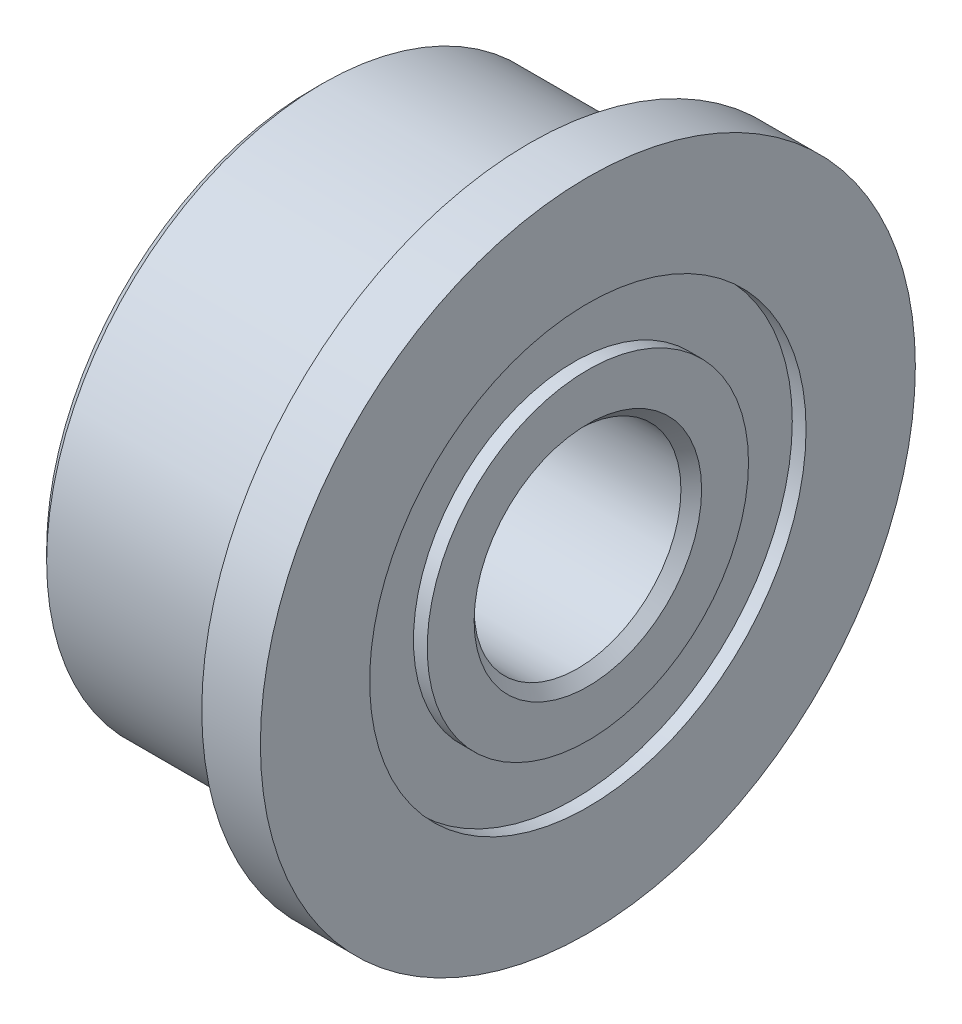
ISO-10303-21;
HEADER;
FILE_DESCRIPTION(('STEP AP214'),'2;1');
FILE_NAME('part.step','',(''),(''),'','','');
FILE_SCHEMA(('AUTOMOTIVE_DESIGN { 1 0 10303 214 1 1 1 1 }'));
ENDSEC;
DATA;
#1=APPLICATION_CONTEXT('core data for automotive mechanical design processes');
#2=APPLICATION_PROTOCOL_DEFINITION('international standard','automotive_design',2000,#1);
#3=PRODUCT_CONTEXT('',#1,'mechanical');
#4=PRODUCT('Part','Part','',(#3));
#5=PRODUCT_RELATED_PRODUCT_CATEGORY('part','',(#4));
#6=PRODUCT_DEFINITION_FORMATION('','',#4);
#7=PRODUCT_DEFINITION_CONTEXT('part definition',#1,'design');
#8=PRODUCT_DEFINITION('design','',#6,#7);
#9=PRODUCT_DEFINITION_SHAPE('','',#8);
#10=(LENGTH_UNIT() NAMED_UNIT(*) SI_UNIT(.MILLI.,.METRE.));
#11=(NAMED_UNIT(*) PLANE_ANGLE_UNIT() SI_UNIT($,.RADIAN.));
#12=(NAMED_UNIT(*) SI_UNIT($,.STERADIAN.) SOLID_ANGLE_UNIT());
#13=UNCERTAINTY_MEASURE_WITH_UNIT(LENGTH_MEASURE(1.E-05),#10,'distance_accuracy_value','');
#14=(GEOMETRIC_REPRESENTATION_CONTEXT(3) GLOBAL_UNCERTAINTY_ASSIGNED_CONTEXT((#13)) GLOBAL_UNIT_ASSIGNED_CONTEXT((#10,
#11,#12)) REPRESENTATION_CONTEXT('',''));
#15=CARTESIAN_POINT('',(0.,0.,0.));
#16=DIRECTION('',(0.,0.,1.));
#17=DIRECTION('',(1.,0.,0.));
#18=AXIS2_PLACEMENT_3D('',#15,#16,#17);
#19=CARTESIAN_POINT('',(-4.,2.33,0.));
#20=DIRECTION('',(-1.,0.,0.));
#21=DIRECTION('',(0.,0.,1.));
#22=AXIS2_PLACEMENT_3D('',#19,#20,#21);
#23=PLANE('',#22);
#24=CARTESIAN_POINT('',(-4.,0.,0.));
#25=DIRECTION('',(-1.,0.,0.));
#26=DIRECTION('',(0.,0.,1.));
#27=AXIS2_PLACEMENT_3D('',#24,#25,#26);
#28=CIRCLE('',#27,1.65);
#29=CARTESIAN_POINT('',(-4.,0.,1.65));
#30=VERTEX_POINT('',#29);
#31=EDGE_CURVE('E42',#30,#30,#28,.F.);
#32=ORIENTED_EDGE('',*,*,#31,.T.);
#33=EDGE_LOOP('',(#32));
#34=FACE_BOUND('',#33,.T.);
#35=CARTESIAN_POINT('',(-4.,0.,0.));
#36=DIRECTION('',(1.,0.,0.));
#37=DIRECTION('',(0.,0.,-1.));
#38=AXIS2_PLACEMENT_3D('',#35,#36,#37);
#39=CIRCLE('',#38,2.33);
#40=CARTESIAN_POINT('',(-4.,0.,-2.33));
#41=VERTEX_POINT('',#40);
#42=EDGE_CURVE('E90',#41,#41,#39,.T.);
#43=ORIENTED_EDGE('',*,*,#42,.F.);
#44=EDGE_LOOP('',(#43));
#45=FACE_BOUND('',#44,.T.);
#46=ADVANCED_FACE('F31',(#34,#45),#23,.T.);
#47=CARTESIAN_POINT('',(0.,0.,0.));
#48=DIRECTION('',(1.,0.,0.));
#49=DIRECTION('',(0.,0.,-1.));
#50=AXIS2_PLACEMENT_3D('',#47,#48,#49);
#51=CYLINDRICAL_SURFACE('',#50,1.5);
#52=CARTESIAN_POINT('',(-0.149999999999999,0.,0.));
#53=DIRECTION('',(1.,0.,0.));
#54=DIRECTION('',(0.,0.,-1.));
#55=AXIS2_PLACEMENT_3D('',#52,#53,#54);
#56=CIRCLE('',#55,1.5);
#57=CARTESIAN_POINT('',(-0.149999999999999,0.,-1.5));
#58=VERTEX_POINT('',#57);
#59=EDGE_CURVE('E51',#58,#58,#56,.T.);
#60=ORIENTED_EDGE('',*,*,#59,.T.);
#61=EDGE_LOOP('',(#60));
#62=FACE_BOUND('',#61,.T.);
#63=CARTESIAN_POINT('',(-3.85,0.,0.));
#64=DIRECTION('',(-1.,0.,0.));
#65=DIRECTION('',(0.,0.,1.));
#66=AXIS2_PLACEMENT_3D('',#63,#64,#65);
#67=CIRCLE('',#66,1.5);
#68=CARTESIAN_POINT('',(-3.85,0.,1.5));
#69=VERTEX_POINT('',#68);
#70=EDGE_CURVE('E54',#69,#69,#67,.T.);
#71=ORIENTED_EDGE('',*,*,#70,.T.);
#72=EDGE_LOOP('',(#71));
#73=FACE_BOUND('',#72,.T.);
#74=ADVANCED_FACE('F98',(#62,#73),#51,.F.);
#75=CARTESIAN_POINT('',(0.,1.5,0.));
#76=DIRECTION('',(1.,0.,0.));
#77=DIRECTION('',(0.,0.,-1.));
#78=AXIS2_PLACEMENT_3D('',#75,#76,#77);
#79=PLANE('',#78);
#80=CARTESIAN_POINT('',(0.,0.,0.));
#81=DIRECTION('',(1.,0.,0.));
#82=DIRECTION('',(0.,0.,-1.));
#83=AXIS2_PLACEMENT_3D('',#80,#81,#82);
#84=CIRCLE('',#83,1.65);
#85=CARTESIAN_POINT('',(0.,0.,-1.65));
#86=VERTEX_POINT('',#85);
#87=EDGE_CURVE('E46',#86,#86,#84,.F.);
#88=ORIENTED_EDGE('',*,*,#87,.T.);
#89=EDGE_LOOP('',(#88));
#90=FACE_BOUND('',#89,.T.);
#91=CARTESIAN_POINT('',(0.,0.,0.));
#92=DIRECTION('',(1.,0.,0.));
#93=DIRECTION('',(0.,0.,-1.));
#94=AXIS2_PLACEMENT_3D('',#91,#92,#93);
#95=CIRCLE('',#94,2.33);
#96=CARTESIAN_POINT('',(0.,0.,-2.33));
#97=VERTEX_POINT('',#96);
#98=EDGE_CURVE('E57',#97,#97,#95,.T.);
#99=ORIENTED_EDGE('',*,*,#98,.T.);
#100=EDGE_LOOP('',(#99));
#101=FACE_BOUND('',#100,.T.);
#102=ADVANCED_FACE('F104',(#90,#101),#79,.T.);
#103=CARTESIAN_POINT('',(0.,0.,0.));
#104=DIRECTION('',(1.,0.,0.));
#105=DIRECTION('',(0.,0.,-1.));
#106=AXIS2_PLACEMENT_3D('',#103,#104,#105);
#107=CYLINDRICAL_SURFACE('',#106,2.33);
#108=CARTESIAN_POINT('',(-0.2,0.,0.));
#109=DIRECTION('',(1.,0.,0.));
#110=DIRECTION('',(0.,0.,-1.));
#111=AXIS2_PLACEMENT_3D('',#108,#109,#110);
#112=CIRCLE('',#111,2.33);
#113=CARTESIAN_POINT('',(-0.2,0.,-2.33));
#114=VERTEX_POINT('',#113);
#115=EDGE_CURVE('E60',#114,#114,#112,.T.);
#116=ORIENTED_EDGE('',*,*,#115,.T.);
#117=EDGE_LOOP('',(#116));
#118=FACE_BOUND('',#117,.T.);
#119=ORIENTED_EDGE('',*,*,#98,.F.);
#120=EDGE_LOOP('',(#119));
#121=FACE_BOUND('',#120,.T.);
#122=ADVANCED_FACE('F171',(#118,#121),#107,.T.);
#123=CARTESIAN_POINT('',(-0.2,3.165,0.));
#124=DIRECTION('',(1.,0.,0.));
#125=DIRECTION('',(0.,0.,-1.));
#126=AXIS2_PLACEMENT_3D('',#123,#124,#125);
#127=PLANE('',#126);
#128=CARTESIAN_POINT('',(-0.2,0.,0.));
#129=DIRECTION('',(1.,0.,0.));
#130=DIRECTION('',(0.,0.,-1.));
#131=AXIS2_PLACEMENT_3D('',#128,#129,#130);
#132=CIRCLE('',#131,3.165);
#133=CARTESIAN_POINT('',(-0.2,0.,-3.165));
#134=VERTEX_POINT('',#133);
#135=EDGE_CURVE('E63',#134,#134,#132,.T.);
#136=ORIENTED_EDGE('',*,*,#135,.T.);
#137=EDGE_LOOP('',(#136));
#138=FACE_BOUND('',#137,.T.);
#139=ORIENTED_EDGE('',*,*,#115,.F.);
#140=EDGE_LOOP('',(#139));
#141=FACE_BOUND('',#140,.T.);
#142=ADVANCED_FACE('F253',(#138,#141),#127,.T.);
#143=CARTESIAN_POINT('',(0.,0.,0.));
#144=DIRECTION('',(1.,0.,0.));
#145=DIRECTION('',(0.,0.,-1.));
#146=AXIS2_PLACEMENT_3D('',#143,#144,#145);
#147=CYLINDRICAL_SURFACE('',#146,3.165);
#148=CARTESIAN_POINT('',(0.,0.,0.));
#149=DIRECTION('',(1.,0.,0.));
#150=DIRECTION('',(0.,0.,-1.));
#151=AXIS2_PLACEMENT_3D('',#148,#149,#150);
#152=CIRCLE('',#151,3.165);
#153=CARTESIAN_POINT('',(0.,0.,-3.165));
#154=VERTEX_POINT('',#153);
#155=EDGE_CURVE('E66',#154,#154,#152,.T.);
#156=ORIENTED_EDGE('',*,*,#155,.T.);
#157=EDGE_LOOP('',(#156));
#158=FACE_BOUND('',#157,.T.);
#159=ORIENTED_EDGE('',*,*,#135,.F.);
#160=EDGE_LOOP('',(#159));
#161=FACE_BOUND('',#160,.T.);
#162=ADVANCED_FACE('F243',(#158,#161),#147,.F.);
#163=CARTESIAN_POINT('',(0.,3.165,0.));
#164=DIRECTION('',(1.,0.,0.));
#165=DIRECTION('',(0.,0.,-1.));
#166=AXIS2_PLACEMENT_3D('',#163,#164,#165);
#167=PLANE('',#166);
#168=CARTESIAN_POINT('',(0.,0.,0.));
#169=DIRECTION('',(1.,0.,0.));
#170=DIRECTION('',(0.,0.,-1.));
#171=AXIS2_PLACEMENT_3D('',#168,#169,#170);
#172=CIRCLE('',#171,4.75);
#173=CARTESIAN_POINT('',(0.,0.,-4.75));
#174=VERTEX_POINT('',#173);
#175=EDGE_CURVE('E69',#174,#174,#172,.T.);
#176=ORIENTED_EDGE('',*,*,#175,.T.);
#177=EDGE_LOOP('',(#176));
#178=FACE_BOUND('',#177,.T.);
#179=ORIENTED_EDGE('',*,*,#155,.F.);
#180=EDGE_LOOP('',(#179));
#181=FACE_BOUND('',#180,.T.);
#182=ADVANCED_FACE('F233',(#178,#181),#167,.T.);
#183=CARTESIAN_POINT('',(0.,0.,0.));
#184=DIRECTION('',(1.,0.,0.));
#185=DIRECTION('',(0.,0.,-1.));
#186=AXIS2_PLACEMENT_3D('',#183,#184,#185);
#187=CYLINDRICAL_SURFACE('',#186,4.75);
#188=CARTESIAN_POINT('',(-0.85,0.,0.));
#189=DIRECTION('',(1.,0.,0.));
#190=DIRECTION('',(0.,0.,-1.));
#191=AXIS2_PLACEMENT_3D('',#188,#189,#190);
#192=CIRCLE('',#191,4.75);
#193=CARTESIAN_POINT('',(-0.85,0.,-4.75));
#194=VERTEX_POINT('',#193);
#195=EDGE_CURVE('E72',#194,#194,#192,.T.);
#196=ORIENTED_EDGE('',*,*,#195,.T.);
#197=EDGE_LOOP('',(#196));
#198=FACE_BOUND('',#197,.T.);
#199=ORIENTED_EDGE('',*,*,#175,.F.);
#200=EDGE_LOOP('',(#199));
#201=FACE_BOUND('',#200,.T.);
#202=ADVANCED_FACE('F223',(#198,#201),#187,.T.);
#203=CARTESIAN_POINT('',(-0.85,4.75,0.));
#204=DIRECTION('',(-1.,0.,0.));
#205=DIRECTION('',(0.,0.,1.));
#206=AXIS2_PLACEMENT_3D('',#203,#204,#205);
#207=PLANE('',#206);
#208=CARTESIAN_POINT('',(-0.85,0.,0.));
#209=DIRECTION('',(1.,0.,0.));
#210=DIRECTION('',(0.,0.,-1.));
#211=AXIS2_PLACEMENT_3D('',#208,#209,#210);
#212=CIRCLE('',#211,4.02);
#213=CARTESIAN_POINT('',(-0.85,0.,-4.02));
#214=VERTEX_POINT('',#213);
#215=EDGE_CURVE('E75',#214,#214,#212,.T.);
#216=ORIENTED_EDGE('',*,*,#215,.T.);
#217=EDGE_LOOP('',(#216));
#218=FACE_BOUND('',#217,.T.);
#219=ORIENTED_EDGE('',*,*,#195,.F.);
#220=EDGE_LOOP('',(#219));
#221=FACE_BOUND('',#220,.T.);
#222=ADVANCED_FACE('F213',(#218,#221),#207,.T.);
#223=CARTESIAN_POINT('',(-0.85,0.,0.));
#224=DIRECTION('',(1.,0.,0.));
#225=DIRECTION('',(0.,0.,-1.));
#226=AXIS2_PLACEMENT_3D('',#223,#224,#225);
#227=TOROIDAL_SURFACE('',#226,4.,0.0200000000000001);
#228=CARTESIAN_POINT('',(-0.87,0.,0.));
#229=DIRECTION('',(1.,0.,0.));
#230=DIRECTION('',(0.,0.,-1.));
#231=AXIS2_PLACEMENT_3D('',#228,#229,#230);
#232=CIRCLE('',#231,4.);
#233=CARTESIAN_POINT('',(-0.87,0.,-4.));
#234=VERTEX_POINT('',#233);
#235=EDGE_CURVE('E78',#234,#234,#232,.T.);
#236=ORIENTED_EDGE('',*,*,#235,.T.);
#237=EDGE_LOOP('',(#236));
#238=FACE_BOUND('',#237,.T.);
#239=ORIENTED_EDGE('',*,*,#215,.F.);
#240=EDGE_LOOP('',(#239));
#241=FACE_BOUND('',#240,.T.);
#242=ADVANCED_FACE('F160',(#238,#241),#227,.F.);
#243=CARTESIAN_POINT('',(0.,0.,0.));
#244=DIRECTION('',(1.,0.,0.));
#245=DIRECTION('',(0.,0.,-1.));
#246=AXIS2_PLACEMENT_3D('',#243,#244,#245);
#247=CYLINDRICAL_SURFACE('',#246,4.);
#248=CARTESIAN_POINT('',(-3.85,0.,0.));
#249=DIRECTION('',(-1.,0.,0.));
#250=DIRECTION('',(0.,0.,1.));
#251=AXIS2_PLACEMENT_3D('',#248,#249,#250);
#252=CIRCLE('',#251,4.);
#253=CARTESIAN_POINT('',(-3.85,0.,4.));
#254=VERTEX_POINT('',#253);
#255=EDGE_CURVE('E38',#254,#254,#252,.F.);
#256=ORIENTED_EDGE('',*,*,#255,.T.);
#257=EDGE_LOOP('',(#256));
#258=FACE_BOUND('',#257,.T.);
#259=ORIENTED_EDGE('',*,*,#235,.F.);
#260=EDGE_LOOP('',(#259));
#261=FACE_BOUND('',#260,.T.);
#262=ADVANCED_FACE('F149',(#258,#261),#247,.T.);
#263=CARTESIAN_POINT('',(-4.,4.,0.));
#264=DIRECTION('',(-1.,0.,0.));
#265=DIRECTION('',(0.,0.,1.));
#266=AXIS2_PLACEMENT_3D('',#263,#264,#265);
#267=PLANE('',#266);
#268=CARTESIAN_POINT('',(-4.,0.,0.));
#269=DIRECTION('',(-1.,0.,0.));
#270=DIRECTION('',(0.,0.,1.));
#271=AXIS2_PLACEMENT_3D('',#268,#269,#270);
#272=CIRCLE('',#271,3.85);
#273=CARTESIAN_POINT('',(-4.,0.,3.85));
#274=VERTEX_POINT('',#273);
#275=EDGE_CURVE('E10',#274,#274,#272,.T.);
#276=ORIENTED_EDGE('',*,*,#275,.T.);
#277=EDGE_LOOP('',(#276));
#278=FACE_BOUND('',#277,.T.);
#279=CARTESIAN_POINT('',(-4.,0.,0.));
#280=DIRECTION('',(1.,0.,0.));
#281=DIRECTION('',(0.,0.,-1.));
#282=AXIS2_PLACEMENT_3D('',#279,#280,#281);
#283=CIRCLE('',#282,3.165);
#284=CARTESIAN_POINT('',(-4.,0.,-3.165));
#285=VERTEX_POINT('',#284);
#286=EDGE_CURVE('E81',#285,#285,#283,.T.);
#287=ORIENTED_EDGE('',*,*,#286,.T.);
#288=EDGE_LOOP('',(#287));
#289=FACE_BOUND('',#288,.T.);
#290=ADVANCED_FACE('F143',(#278,#289),#267,.T.);
#291=CARTESIAN_POINT('',(0.,0.,0.));
#292=DIRECTION('',(1.,0.,0.));
#293=DIRECTION('',(0.,0.,-1.));
#294=AXIS2_PLACEMENT_3D('',#291,#292,#293);
#295=CYLINDRICAL_SURFACE('',#294,3.165);
#296=CARTESIAN_POINT('',(-3.8,0.,0.));
#297=DIRECTION('',(1.,0.,0.));
#298=DIRECTION('',(0.,0.,-1.));
#299=AXIS2_PLACEMENT_3D('',#296,#297,#298);
#300=CIRCLE('',#299,3.165);
#301=CARTESIAN_POINT('',(-3.8,0.,-3.165));
#302=VERTEX_POINT('',#301);
#303=EDGE_CURVE('E84',#302,#302,#300,.T.);
#304=ORIENTED_EDGE('',*,*,#303,.T.);
#305=EDGE_LOOP('',(#304));
#306=FACE_BOUND('',#305,.T.);
#307=ORIENTED_EDGE('',*,*,#286,.F.);
#308=EDGE_LOOP('',(#307));
#309=FACE_BOUND('',#308,.T.);
#310=ADVANCED_FACE('F148',(#306,#309),#295,.F.);
#311=CARTESIAN_POINT('',(-3.8,3.165,0.));
#312=DIRECTION('',(-1.,0.,0.));
#313=DIRECTION('',(0.,0.,1.));
#314=AXIS2_PLACEMENT_3D('',#311,#312,#313);
#315=PLANE('',#314);
#316=CARTESIAN_POINT('',(-3.8,0.,0.));
#317=DIRECTION('',(1.,0.,0.));
#318=DIRECTION('',(0.,0.,-1.));
#319=AXIS2_PLACEMENT_3D('',#316,#317,#318);
#320=CIRCLE('',#319,2.33);
#321=CARTESIAN_POINT('',(-3.8,0.,-2.33));
#322=VERTEX_POINT('',#321);
#323=EDGE_CURVE('E87',#322,#322,#320,.T.);
#324=ORIENTED_EDGE('',*,*,#323,.T.);
#325=EDGE_LOOP('',(#324));
#326=FACE_BOUND('',#325,.T.);
#327=ORIENTED_EDGE('',*,*,#303,.F.);
#328=EDGE_LOOP('',(#327));
#329=FACE_BOUND('',#328,.T.);
#330=ADVANCED_FACE('F190',(#326,#329),#315,.T.);
#331=CARTESIAN_POINT('',(0.,0.,0.));
#332=DIRECTION('',(1.,0.,0.));
#333=DIRECTION('',(0.,0.,-1.));
#334=AXIS2_PLACEMENT_3D('',#331,#332,#333);
#335=CYLINDRICAL_SURFACE('',#334,2.33);
#336=ORIENTED_EDGE('',*,*,#42,.T.);
#337=EDGE_LOOP('',(#336));
#338=FACE_BOUND('',#337,.T.);
#339=ORIENTED_EDGE('',*,*,#323,.F.);
#340=EDGE_LOOP('',(#339));
#341=FACE_BOUND('',#340,.T.);
#342=ADVANCED_FACE('F94',(#338,#341),#335,.T.);
#343=CARTESIAN_POINT('',(-0.149999999999999,0.,0.));
#344=DIRECTION('',(1.,0.,0.));
#345=DIRECTION('',(0.,0.,-1.));
#346=AXIS2_PLACEMENT_3D('',#343,#344,#345);
#347=CONICAL_SURFACE('',#346,1.5,0.785398163397449);
#348=ORIENTED_EDGE('',*,*,#87,.F.);
#349=EDGE_LOOP('',(#348));
#350=FACE_BOUND('',#349,.T.);
#351=ORIENTED_EDGE('',*,*,#59,.F.);
#352=EDGE_LOOP('',(#351));
#353=FACE_BOUND('',#352,.T.);
#354=ADVANCED_FACE('F109',(#350,#353),#347,.F.);
#355=CARTESIAN_POINT('',(-4.,0.,0.));
#356=DIRECTION('',(-1.,0.,0.));
#357=DIRECTION('',(0.,0.,1.));
#358=AXIS2_PLACEMENT_3D('',#355,#356,#357);
#359=CONICAL_SURFACE('',#358,1.65,0.785398163397447);
#360=ORIENTED_EDGE('',*,*,#70,.F.);
#361=EDGE_LOOP('',(#360));
#362=FACE_BOUND('',#361,.T.);
#363=ORIENTED_EDGE('',*,*,#31,.F.);
#364=EDGE_LOOP('',(#363));
#365=FACE_BOUND('',#364,.T.);
#366=ADVANCED_FACE('F111',(#362,#365),#359,.F.);
#367=CARTESIAN_POINT('',(-3.85,0.,0.));
#368=DIRECTION('',(1.,0.,0.));
#369=DIRECTION('',(0.,0.,-1.));
#370=AXIS2_PLACEMENT_3D('',#367,#368,#369);
#371=CONICAL_SURFACE('',#370,4.,0.785398163397448);
#372=ORIENTED_EDGE('',*,*,#275,.F.);
#373=EDGE_LOOP('',(#372));
#374=FACE_BOUND('',#373,.T.);
#375=ORIENTED_EDGE('',*,*,#255,.F.);
#376=EDGE_LOOP('',(#375));
#377=FACE_BOUND('',#376,.T.);
#378=ADVANCED_FACE('F33',(#374,#377),#371,.T.);
#379=CLOSED_SHELL('',(#46,#74,#102,#122,#142,#162,#182,#202,#222,#242,#262,#290,#310,#330,#342,
#354,#366,#378));
#380=MANIFOLD_SOLID_BREP('B2',#379);
#381=ADVANCED_BREP_SHAPE_REPRESENTATION('',(#18,#380),#14);
#382=SHAPE_DEFINITION_REPRESENTATION(#9,#381);
ENDSEC;
END-ISO-10303-21;
